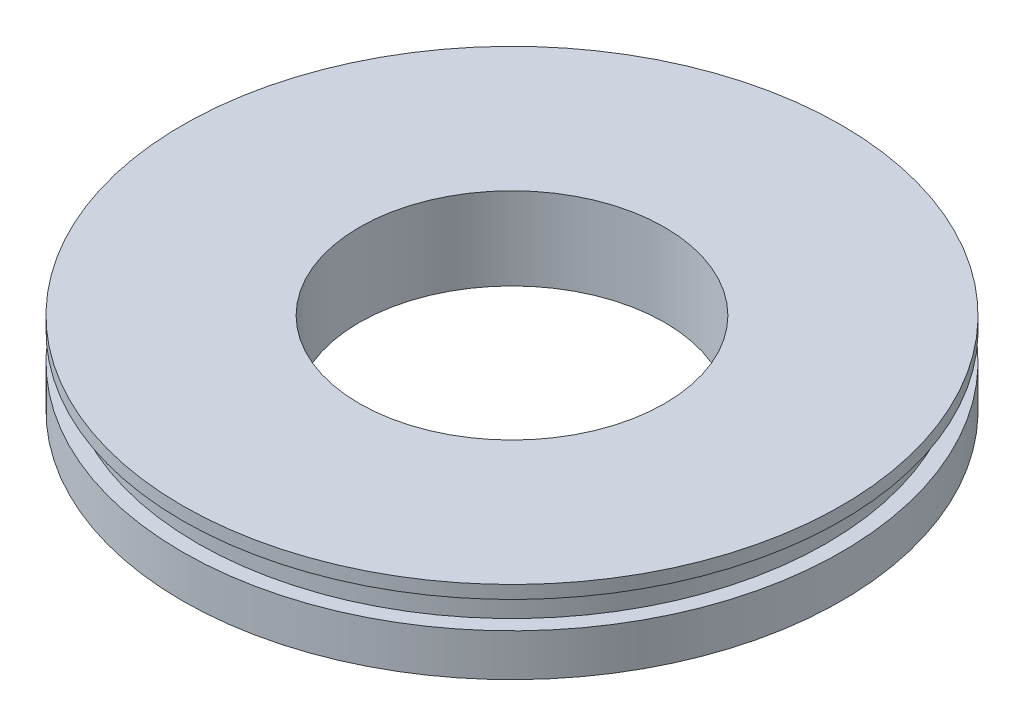
ISO-10303-21;
HEADER;
FILE_DESCRIPTION(('STEP AP214'),'2;1');
FILE_NAME('part.step','',(''),(''),'','','');
FILE_SCHEMA(('AUTOMOTIVE_DESIGN { 1 0 10303 214 1 1 1 1 }'));
ENDSEC;
DATA;
#1=APPLICATION_CONTEXT('core data for automotive mechanical design processes');
#2=APPLICATION_PROTOCOL_DEFINITION('international standard','automotive_design',2000,#1);
#3=PRODUCT_CONTEXT('',#1,'mechanical');
#4=PRODUCT('Part','Part','',(#3));
#5=PRODUCT_RELATED_PRODUCT_CATEGORY('part','',(#4));
#6=PRODUCT_DEFINITION_FORMATION('','',#4);
#7=PRODUCT_DEFINITION_CONTEXT('part definition',#1,'design');
#8=PRODUCT_DEFINITION('design','',#6,#7);
#9=PRODUCT_DEFINITION_SHAPE('','',#8);
#10=(LENGTH_UNIT() NAMED_UNIT(*) SI_UNIT(.MILLI.,.METRE.));
#11=(NAMED_UNIT(*) PLANE_ANGLE_UNIT() SI_UNIT($,.RADIAN.));
#12=(NAMED_UNIT(*) SI_UNIT($,.STERADIAN.) SOLID_ANGLE_UNIT());
#13=UNCERTAINTY_MEASURE_WITH_UNIT(LENGTH_MEASURE(1.E-05),#10,'distance_accuracy_value','');
#14=(GEOMETRIC_REPRESENTATION_CONTEXT(3) GLOBAL_UNCERTAINTY_ASSIGNED_CONTEXT((#13)) GLOBAL_UNIT_ASSIGNED_CONTEXT((#10,
#11,#12)) REPRESENTATION_CONTEXT('',''));
#15=CARTESIAN_POINT('',(0.,0.,0.));
#16=DIRECTION('',(0.,0.,1.));
#17=DIRECTION('',(1.,0.,0.));
#18=AXIS2_PLACEMENT_3D('',#15,#16,#17);
#19=CARTESIAN_POINT('',(0.,2.69408399999972,30.84068));
#20=DIRECTION('',(0.,1.,0.));
#21=DIRECTION('',(0.,0.,1.));
#22=AXIS2_PLACEMENT_3D('',#19,#20,#21);
#23=PLANE('',#22);
#24=CARTESIAN_POINT('',(0.,2.69408399999948,0.));
#25=DIRECTION('',(0.,1.,0.));
#26=DIRECTION('',(0.,0.,1.));
#27=AXIS2_PLACEMENT_3D('',#24,#25,#26);
#28=CIRCLE('',#27,30.84068);
#29=CARTESIAN_POINT('',(0.,2.69408399999948,30.84068));
#30=VERTEX_POINT('',#29);
#31=EDGE_CURVE('E65',#30,#30,#28,.T.);
#32=ORIENTED_EDGE('',*,*,#31,.T.);
#33=EDGE_LOOP('',(#32));
#34=FACE_BOUND('',#33,.T.);
#35=CARTESIAN_POINT('',(0.,2.69408399999995,0.));
#36=DIRECTION('',(0.,1.,0.));
#37=DIRECTION('',(0.,0.,1.));
#38=AXIS2_PLACEMENT_3D('',#35,#36,#37);
#39=CIRCLE('',#38,14.2875);
#40=CARTESIAN_POINT('',(0.,2.69408399999995,14.2875));
#41=VERTEX_POINT('',#40);
#42=EDGE_CURVE('E10',#41,#41,#39,.T.);
#43=ORIENTED_EDGE('',*,*,#42,.F.);
#44=EDGE_LOOP('',(#43));
#45=FACE_BOUND('',#44,.T.);
#46=ADVANCED_FACE('F37',(#34,#45),#23,.T.);
#47=CARTESIAN_POINT('',(0.,0.,0.));
#48=DIRECTION('',(0.,1.,0.));
#49=DIRECTION('',(0.,0.,1.));
#50=AXIS2_PLACEMENT_3D('',#47,#48,#49);
#51=CYLINDRICAL_SURFACE('',#50,14.2875);
#52=ORIENTED_EDGE('',*,*,#42,.T.);
#53=EDGE_LOOP('',(#52));
#54=FACE_BOUND('',#53,.T.);
#55=CARTESIAN_POINT('',(0.,-5.02081799999997,0.));
#56=DIRECTION('',(0.,1.,0.));
#57=DIRECTION('',(0.,0.,1.));
#58=AXIS2_PLACEMENT_3D('',#55,#56,#57);
#59=CIRCLE('',#58,14.2875);
#60=CARTESIAN_POINT('',(0.,-5.02081799999997,14.2875));
#61=VERTEX_POINT('',#60);
#62=EDGE_CURVE('E43',#61,#61,#59,.T.);
#63=ORIENTED_EDGE('',*,*,#62,.F.);
#64=EDGE_LOOP('',(#63));
#65=FACE_BOUND('',#64,.T.);
#66=ADVANCED_FACE('F83',(#54,#65),#51,.F.);
#67=CARTESIAN_POINT('',(0.,-5.02081799999997,14.2875));
#68=DIRECTION('',(0.,-1.,0.));
#69=DIRECTION('',(0.,0.,-1.));
#70=AXIS2_PLACEMENT_3D('',#67,#68,#69);
#71=PLANE('',#70);
#72=ORIENTED_EDGE('',*,*,#62,.T.);
#73=EDGE_LOOP('',(#72));
#74=FACE_BOUND('',#73,.T.);
#75=CARTESIAN_POINT('',(0.,-5.02081799999997,0.));
#76=DIRECTION('',(0.,1.,0.));
#77=DIRECTION('',(0.,0.,1.));
#78=AXIS2_PLACEMENT_3D('',#75,#76,#77);
#79=CIRCLE('',#78,30.84068);
#80=CARTESIAN_POINT('',(0.,-5.02081799999997,30.84068));
#81=VERTEX_POINT('',#80);
#82=EDGE_CURVE('E47',#81,#81,#79,.T.);
#83=ORIENTED_EDGE('',*,*,#82,.F.);
#84=EDGE_LOOP('',(#83));
#85=FACE_BOUND('',#84,.T.);
#86=ADVANCED_FACE('F87',(#74,#85),#71,.T.);
#87=CARTESIAN_POINT('',(0.,0.,0.));
#88=DIRECTION('',(0.,1.,0.));
#89=DIRECTION('',(0.,0.,1.));
#90=AXIS2_PLACEMENT_3D('',#87,#88,#89);
#91=CYLINDRICAL_SURFACE('',#90,30.84068);
#92=ORIENTED_EDGE('',*,*,#82,.T.);
#93=EDGE_LOOP('',(#92));
#94=FACE_BOUND('',#93,.T.);
#95=CARTESIAN_POINT('',(0.,-1.06206800000024,0.));
#96=DIRECTION('',(0.,1.,0.));
#97=DIRECTION('',(0.,0.,1.));
#98=AXIS2_PLACEMENT_3D('',#95,#96,#97);
#99=CIRCLE('',#98,30.84068);
#100=CARTESIAN_POINT('',(0.,-1.06206800000024,30.84068));
#101=VERTEX_POINT('',#100);
#102=EDGE_CURVE('E51',#101,#101,#99,.T.);
#103=ORIENTED_EDGE('',*,*,#102,.F.);
#104=EDGE_LOOP('',(#103));
#105=FACE_BOUND('',#104,.T.);
#106=ADVANCED_FACE('F91',(#94,#105),#91,.T.);
#107=CARTESIAN_POINT('',(0.,-1.06206800000024,30.84068));
#108=DIRECTION('',(0.,1.,0.));
#109=DIRECTION('',(0.,0.,1.));
#110=AXIS2_PLACEMENT_3D('',#107,#108,#109);
#111=PLANE('',#110);
#112=ORIENTED_EDGE('',*,*,#102,.T.);
#113=EDGE_LOOP('',(#112));
#114=FACE_BOUND('',#113,.T.);
#115=CARTESIAN_POINT('',(0.,-1.06206800000024,0.));
#116=DIRECTION('',(0.,1.,0.));
#117=DIRECTION('',(0.,0.,1.));
#118=AXIS2_PLACEMENT_3D('',#115,#116,#117);
#119=CIRCLE('',#118,29.43479);
#120=CARTESIAN_POINT('',(0.,-1.06206800000024,29.43479));
#121=VERTEX_POINT('',#120);
#122=EDGE_CURVE('E56',#121,#121,#119,.T.);
#123=ORIENTED_EDGE('',*,*,#122,.F.);
#124=EDGE_LOOP('',(#123));
#125=FACE_BOUND('',#124,.T.);
#126=ADVANCED_FACE('F97',(#114,#125),#111,.T.);
#127=CARTESIAN_POINT('',(0.,0.,0.));
#128=DIRECTION('',(0.,1.,0.));
#129=DIRECTION('',(0.,0.,1.));
#130=AXIS2_PLACEMENT_3D('',#127,#128,#129);
#131=CYLINDRICAL_SURFACE('',#130,29.43479);
#132=ORIENTED_EDGE('',*,*,#122,.T.);
#133=EDGE_LOOP('',(#132));
#134=FACE_BOUND('',#133,.T.);
#135=CARTESIAN_POINT('',(0.,1.47793199999976,0.));
#136=DIRECTION('',(0.,1.,0.));
#137=DIRECTION('',(0.,0.,1.));
#138=AXIS2_PLACEMENT_3D('',#135,#136,#137);
#139=CIRCLE('',#138,29.43479);
#140=CARTESIAN_POINT('',(0.,1.47793199999976,29.43479));
#141=VERTEX_POINT('',#140);
#142=EDGE_CURVE('E59',#141,#141,#139,.T.);
#143=ORIENTED_EDGE('',*,*,#142,.F.);
#144=EDGE_LOOP('',(#143));
#145=FACE_BOUND('',#144,.T.);
#146=ADVANCED_FACE('F79',(#134,#145),#131,.T.);
#147=CARTESIAN_POINT('',(0.,1.47793199999976,29.43479));
#148=DIRECTION('',(0.,-1.,0.));
#149=DIRECTION('',(0.,0.,-1.));
#150=AXIS2_PLACEMENT_3D('',#147,#148,#149);
#151=PLANE('',#150);
#152=ORIENTED_EDGE('',*,*,#142,.T.);
#153=EDGE_LOOP('',(#152));
#154=FACE_BOUND('',#153,.T.);
#155=CARTESIAN_POINT('',(0.,1.47793199999976,0.));
#156=DIRECTION('',(0.,1.,0.));
#157=DIRECTION('',(0.,0.,1.));
#158=AXIS2_PLACEMENT_3D('',#155,#156,#157);
#159=CIRCLE('',#158,30.84068);
#160=CARTESIAN_POINT('',(0.,1.47793199999976,30.84068));
#161=VERTEX_POINT('',#160);
#162=EDGE_CURVE('E62',#161,#161,#159,.T.);
#163=ORIENTED_EDGE('',*,*,#162,.F.);
#164=EDGE_LOOP('',(#163));
#165=FACE_BOUND('',#164,.T.);
#166=ADVANCED_FACE('F73',(#154,#165),#151,.T.);
#167=CARTESIAN_POINT('',(0.,0.,0.));
#168=DIRECTION('',(0.,1.,0.));
#169=DIRECTION('',(0.,0.,1.));
#170=AXIS2_PLACEMENT_3D('',#167,#168,#169);
#171=CYLINDRICAL_SURFACE('',#170,30.84068);
#172=ORIENTED_EDGE('',*,*,#162,.T.);
#173=EDGE_LOOP('',(#172));
#174=FACE_BOUND('',#173,.T.);
#175=ORIENTED_EDGE('',*,*,#31,.F.);
#176=EDGE_LOOP('',(#175));
#177=FACE_BOUND('',#176,.T.);
#178=ADVANCED_FACE('F71',(#174,#177),#171,.T.);
#179=CLOSED_SHELL('',(#46,#66,#86,#106,#126,#146,#166,#178));
#180=MANIFOLD_SOLID_BREP('B2',#179);
#181=ADVANCED_BREP_SHAPE_REPRESENTATION('',(#18,#180),#14);
#182=SHAPE_DEFINITION_REPRESENTATION(#9,#181);
ENDSEC;
END-ISO-10303-21;
